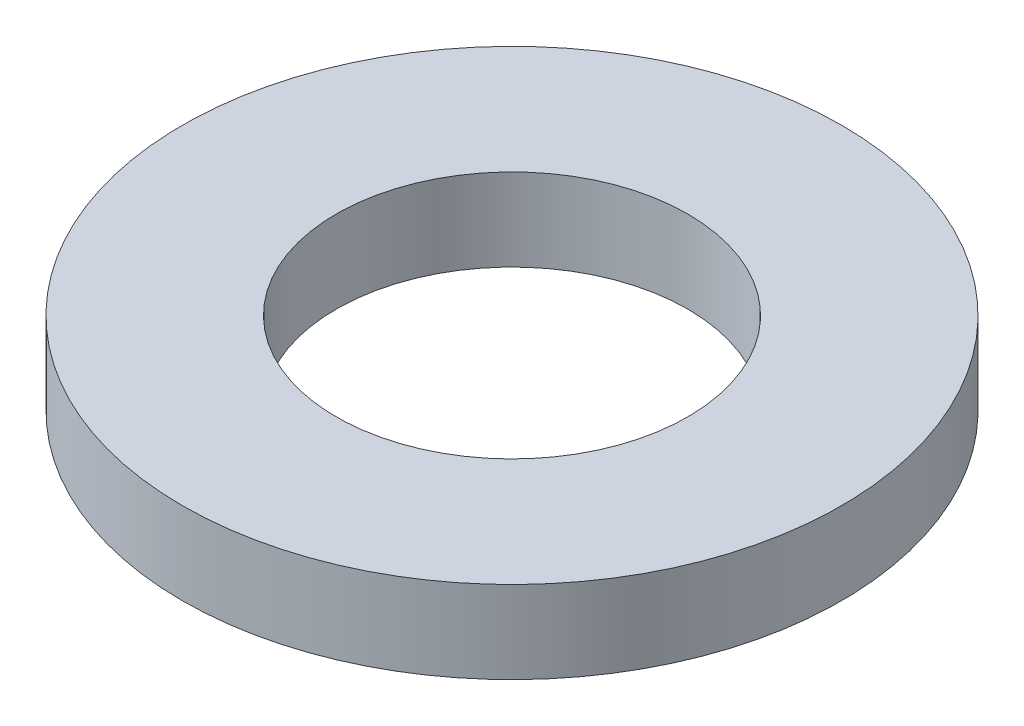
ISO-10303-21;
HEADER;
FILE_DESCRIPTION(('STEP AP214'),'2;1');
FILE_NAME('part.step','',(''),(''),'','','');
FILE_SCHEMA(('AUTOMOTIVE_DESIGN { 1 0 10303 214 1 1 1 1 }'));
ENDSEC;
DATA;
#1=APPLICATION_CONTEXT('core data for automotive mechanical design processes');
#2=APPLICATION_PROTOCOL_DEFINITION('international standard','automotive_design',2000,#1);
#3=PRODUCT_CONTEXT('',#1,'mechanical');
#4=PRODUCT('Part','Part','',(#3));
#5=PRODUCT_RELATED_PRODUCT_CATEGORY('part','',(#4));
#6=PRODUCT_DEFINITION_FORMATION('','',#4);
#7=PRODUCT_DEFINITION_CONTEXT('part definition',#1,'design');
#8=PRODUCT_DEFINITION('design','',#6,#7);
#9=PRODUCT_DEFINITION_SHAPE('','',#8);
#10=(LENGTH_UNIT() NAMED_UNIT(*) SI_UNIT(.MILLI.,.METRE.));
#11=(NAMED_UNIT(*) PLANE_ANGLE_UNIT() SI_UNIT($,.RADIAN.));
#12=(NAMED_UNIT(*) SI_UNIT($,.STERADIAN.) SOLID_ANGLE_UNIT());
#13=UNCERTAINTY_MEASURE_WITH_UNIT(LENGTH_MEASURE(1.E-05),#10,'distance_accuracy_value','');
#14=(GEOMETRIC_REPRESENTATION_CONTEXT(3) GLOBAL_UNCERTAINTY_ASSIGNED_CONTEXT((#13)) GLOBAL_UNIT_ASSIGNED_CONTEXT((#10,
#11,#12)) REPRESENTATION_CONTEXT('',''));
#15=CARTESIAN_POINT('',(0.,0.,0.));
#16=DIRECTION('',(0.,0.,1.));
#17=DIRECTION('',(1.,0.,0.));
#18=AXIS2_PLACEMENT_3D('',#15,#16,#17);
#19=CARTESIAN_POINT('',(0.,1.5,0.));
#20=DIRECTION('',(0.,1.,0.));
#21=DIRECTION('',(0.,0.,-1.));
#22=AXIS2_PLACEMENT_3D('',#19,#20,#21);
#23=PLANE('',#22);
#24=CARTESIAN_POINT('',(0.,1.5,0.));
#25=DIRECTION('',(0.,-1.,0.));
#26=DIRECTION('',(0.,0.,-1.));
#27=AXIS2_PLACEMENT_3D('',#24,#25,#26);
#28=CIRCLE('',#27,6.);
#29=CARTESIAN_POINT('',(0.,1.5,-6.));
#30=VERTEX_POINT('',#29);
#31=EDGE_CURVE('E10',#30,#30,#28,.T.);
#32=ORIENTED_EDGE('',*,*,#31,.F.);
#33=EDGE_LOOP('',(#32));
#34=FACE_BOUND('',#33,.T.);
#35=CARTESIAN_POINT('',(0.,1.5,0.));
#36=DIRECTION('',(0.,-1.,0.));
#37=DIRECTION('',(0.,0.,-1.));
#38=AXIS2_PLACEMENT_3D('',#35,#36,#37);
#39=CIRCLE('',#38,3.2);
#40=CARTESIAN_POINT('',(0.,1.5,-3.2));
#41=VERTEX_POINT('',#40);
#42=EDGE_CURVE('E43',#41,#41,#39,.T.);
#43=ORIENTED_EDGE('',*,*,#42,.T.);
#44=EDGE_LOOP('',(#43));
#45=FACE_BOUND('',#44,.T.);
#46=ADVANCED_FACE('F32',(#34,#45),#23,.T.);
#47=CARTESIAN_POINT('',(0.,0.,0.));
#48=DIRECTION('',(0.,1.,0.));
#49=DIRECTION('',(0.,0.,-1.));
#50=AXIS2_PLACEMENT_3D('',#47,#48,#49);
#51=PLANE('',#50);
#52=CARTESIAN_POINT('',(0.,0.,0.));
#53=DIRECTION('',(0.,-1.,0.));
#54=DIRECTION('',(0.,0.,-1.));
#55=AXIS2_PLACEMENT_3D('',#52,#53,#54);
#56=CIRCLE('',#55,6.);
#57=CARTESIAN_POINT('',(0.,0.,-6.));
#58=VERTEX_POINT('',#57);
#59=EDGE_CURVE('E36',#58,#58,#56,.T.);
#60=ORIENTED_EDGE('',*,*,#59,.T.);
#61=EDGE_LOOP('',(#60));
#62=FACE_BOUND('',#61,.T.);
#63=CARTESIAN_POINT('',(0.,0.,0.));
#64=DIRECTION('',(0.,-1.,0.));
#65=DIRECTION('',(0.,0.,-1.));
#66=AXIS2_PLACEMENT_3D('',#63,#64,#65);
#67=CIRCLE('',#66,3.2);
#68=CARTESIAN_POINT('',(0.,0.,-3.2));
#69=VERTEX_POINT('',#68);
#70=EDGE_CURVE('E45',#69,#69,#67,.T.);
#71=ORIENTED_EDGE('',*,*,#70,.F.);
#72=EDGE_LOOP('',(#71));
#73=FACE_BOUND('',#72,.T.);
#74=ADVANCED_FACE('F58',(#62,#73),#51,.F.);
#75=CARTESIAN_POINT('',(0.,1.5,0.));
#76=DIRECTION('',(0.,-1.,0.));
#77=DIRECTION('',(0.,0.,1.));
#78=AXIS2_PLACEMENT_3D('',#75,#76,#77);
#79=CYLINDRICAL_SURFACE('',#78,6.);
#80=ORIENTED_EDGE('',*,*,#31,.T.);
#81=EDGE_LOOP('',(#80));
#82=FACE_BOUND('',#81,.T.);
#83=ORIENTED_EDGE('',*,*,#59,.F.);
#84=EDGE_LOOP('',(#83));
#85=FACE_BOUND('',#84,.T.);
#86=ADVANCED_FACE('F34',(#82,#85),#79,.T.);
#87=CARTESIAN_POINT('',(0.,1.5,0.));
#88=DIRECTION('',(0.,-1.,0.));
#89=DIRECTION('',(0.,0.,1.));
#90=AXIS2_PLACEMENT_3D('',#87,#88,#89);
#91=CYLINDRICAL_SURFACE('',#90,3.2);
#92=ORIENTED_EDGE('',*,*,#42,.F.);
#93=EDGE_LOOP('',(#92));
#94=FACE_BOUND('',#93,.T.);
#95=ORIENTED_EDGE('',*,*,#70,.T.);
#96=EDGE_LOOP('',(#95));
#97=FACE_BOUND('',#96,.T.);
#98=ADVANCED_FACE('F52',(#94,#97),#91,.F.);
#99=CLOSED_SHELL('',(#46,#74,#86,#98));
#100=MANIFOLD_SOLID_BREP('B2',#99);
#101=ADVANCED_BREP_SHAPE_REPRESENTATION('',(#18,#100),#14);
#102=SHAPE_DEFINITION_REPRESENTATION(#9,#101);
ENDSEC;
END-ISO-10303-21;
